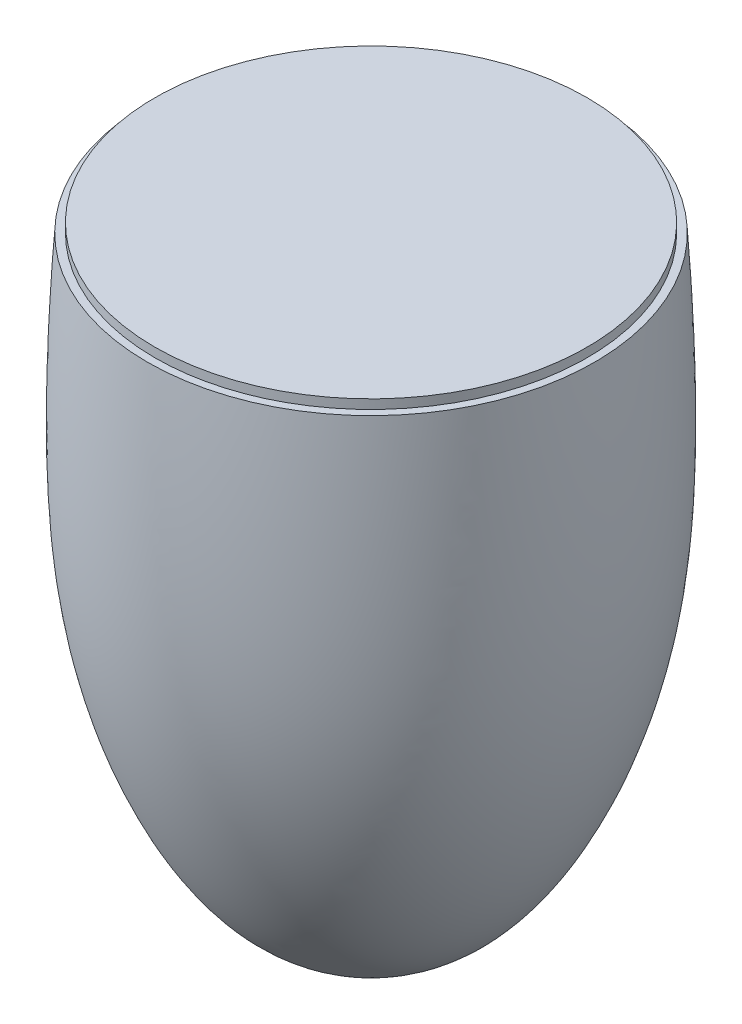
ISO-10303-21;
HEADER;
FILE_DESCRIPTION(('STEP AP214'),'2;1');
FILE_NAME('part.step','',(''),(''),'','','');
FILE_SCHEMA(('AUTOMOTIVE_DESIGN { 1 0 10303 214 1 1 1 1 }'));
ENDSEC;
DATA;
#1=APPLICATION_CONTEXT('core data for automotive mechanical design processes');
#2=APPLICATION_PROTOCOL_DEFINITION('international standard','automotive_design',2000,#1);
#3=PRODUCT_CONTEXT('',#1,'mechanical');
#4=PRODUCT('Part','Part','',(#3));
#5=PRODUCT_RELATED_PRODUCT_CATEGORY('part','',(#4));
#6=PRODUCT_DEFINITION_FORMATION('','',#4);
#7=PRODUCT_DEFINITION_CONTEXT('part definition',#1,'design');
#8=PRODUCT_DEFINITION('design','',#6,#7);
#9=PRODUCT_DEFINITION_SHAPE('','',#8);
#10=(LENGTH_UNIT() NAMED_UNIT(*) SI_UNIT(.MILLI.,.METRE.));
#11=(NAMED_UNIT(*) PLANE_ANGLE_UNIT() SI_UNIT($,.RADIAN.));
#12=(NAMED_UNIT(*) SI_UNIT($,.STERADIAN.) SOLID_ANGLE_UNIT());
#13=UNCERTAINTY_MEASURE_WITH_UNIT(LENGTH_MEASURE(1.E-05),#10,'distance_accuracy_value','');
#14=(GEOMETRIC_REPRESENTATION_CONTEXT(3) GLOBAL_UNCERTAINTY_ASSIGNED_CONTEXT((#13)) GLOBAL_UNIT_ASSIGNED_CONTEXT((#10,
#11,#12)) REPRESENTATION_CONTEXT('',''));
#15=CARTESIAN_POINT('',(0.,0.,0.));
#16=DIRECTION('',(0.,0.,1.));
#17=DIRECTION('',(1.,0.,0.));
#18=AXIS2_PLACEMENT_3D('',#15,#16,#17);
#19=CARTESIAN_POINT('',(0.,81.9449157715,24.1451148987));
#20=DIRECTION('',(0.,1.,0.));
#21=DIRECTION('',(0.,0.,1.));
#22=AXIS2_PLACEMENT_3D('',#19,#20,#21);
#23=PLANE('',#22);
#24=CARTESIAN_POINT('',(0.,81.9449157715,0.));
#25=DIRECTION('',(0.,1.,0.));
#26=DIRECTION('',(0.,0.,1.));
#27=AXIS2_PLACEMENT_3D('',#24,#25,#26);
#28=CIRCLE('',#27,24.1451148987);
#29=CARTESIAN_POINT('',(0.,81.9449157715,24.1451148987));
#30=VERTEX_POINT('',#29);
#31=EDGE_CURVE('E19',#30,#30,#28,.F.);
#32=ORIENTED_EDGE('',*,*,#31,.F.);
#33=EDGE_LOOP('',(#32));
#34=FACE_BOUND('',#33,.T.);
#35=ADVANCED_FACE('F16',(#34),#23,.T.);
#36=CARTESIAN_POINT('',(0.,47.5297081951,0.));
#37=DIRECTION('',(0.,1.,0.));
#38=DIRECTION('',(0.,0.,1.));
#39=AXIS2_PLACEMENT_3D('',#36,#37,#38);
#40=CYLINDRICAL_SURFACE('',#39,24.1451148987);
#41=CARTESIAN_POINT('',(0.,80.9171676635999,0.));
#42=DIRECTION('',(0.,1.,0.));
#43=DIRECTION('',(0.479425538604204,0.,0.877582561890372));
#44=AXIS2_PLACEMENT_3D('',#41,#42,#43);
#45=CIRCLE('',#44,24.1451148986807);
#46=CARTESIAN_POINT('',(11.5757847149604,80.9171676635999,21.1893317899216));
#47=VERTEX_POINT('',#46);
#48=EDGE_CURVE('E23',#47,#47,#45,.T.);
#49=ORIENTED_EDGE('',*,*,#48,.T.);
#50=EDGE_LOOP('',(#49));
#51=FACE_BOUND('',#50,.T.);
#52=ORIENTED_EDGE('',*,*,#31,.T.);
#53=EDGE_LOOP('',(#52));
#54=FACE_BOUND('',#53,.T.);
#55=ADVANCED_FACE('F36',(#51,#54),#40,.T.);
#56=CARTESIAN_POINT('',(0.,80.9195556640865,0.));
#57=DIRECTION('',(0.,1.,0.));
#58=DIRECTION('',(0.,0.,1.));
#59=AXIS2_PLACEMENT_3D('',#56,#57,#58);
#60=CONICAL_SURFACE('',#59,24.9904174804408,1.56797130983);
#61=CARTESIAN_POINT('',(0.,80.9195556641,0.));
#62=DIRECTION('',(0.,-1.,0.));
#63=DIRECTION('',(0.,0.,1.));
#64=AXIS2_PLACEMENT_3D('',#61,#62,#63);
#65=CIRCLE('',#64,24.9904174805);
#66=CARTESIAN_POINT('',(0.,80.9195556641,24.9904174805));
#67=VERTEX_POINT('',#66);
#68=EDGE_CURVE('E11',#67,#67,#65,.T.);
#69=ORIENTED_EDGE('',*,*,#68,.F.);
#70=EDGE_LOOP('',(#69));
#71=FACE_BOUND('',#70,.T.);
#72=ORIENTED_EDGE('',*,*,#48,.F.);
#73=EDGE_LOOP('',(#72));
#74=FACE_BOUND('',#73,.T.);
#75=ADVANCED_FACE('F30',(#71,#74),#60,.F.);
#76=CARTESIAN_POINT('',(0.,13.2139997482,0.));
#77=CARTESIAN_POINT('',(0.,13.1343860519,0.701525521778));
#78=CARTESIAN_POINT('',(0.,13.0946252586,1.39098266925));
#79=CARTESIAN_POINT('',(0.,13.0947173683,2.0683714424));
#80=CARTESIAN_POINT('',(0.,13.4000439852,7.15386304117));
#81=CARTESIAN_POINT('',(0.,16.0068979726,11.5324651143));
#82=CARTESIAN_POINT('',(0.,19.8763681206,14.795236085));
#83=CARTESIAN_POINT('',(0.,29.4703767584,20.5230421088));
#84=CARTESIAN_POINT('',(0.,39.6672446479,23.6110537972));
#85=CARTESIAN_POINT('',(0.,44.6271882231,24.5798553527));
#86=CARTESIAN_POINT('',(0.,54.3610779814,25.7066458761));
#87=CARTESIAN_POINT('',(0.,64.3115919466,25.7342793237));
#88=CARTESIAN_POINT('',(0.,69.5902544986,25.6172746961));
#89=CARTESIAN_POINT('',(0.,75.1262424044,25.3693207484));
#90=CARTESIAN_POINT('',(0.,80.9195556641,24.9904174805));
#91=(BOUNDED_CURVE() B_SPLINE_CURVE(5,(#76,#77,#78,#79,#80,#81,#82,#83,#84,#85,#86,#87,#88,#89,
#90),.UNSPECIFIED.,.F.,.F.) B_SPLINE_CURVE_WITH_KNOTS((6,3,3,3,6),(0.,3.38691329956,
25.8884578925,51.9993142439,78.5983632273),
.UNSPECIFIED.) CURVE() GEOMETRIC_REPRESENTATION_ITEM() RATIONAL_B_SPLINE_CURVE((1.,1.,1.,1.,1.,
1.,1.,1.,1.,1.,1.,1.,1.,1.,1.)) REPRESENTATION_ITEM(''));
#92=CARTESIAN_POINT('',(0.,47.5297081951,0.));
#93=DIRECTION('',(0.,-1.,0.));
#94=AXIS1_PLACEMENT('',#92,#93);
#95=SURFACE_OF_REVOLUTION('',#91,#94);
#96=CARTESIAN_POINT('',(2.33611357876979E-07,13.2139996929011,4.27622722246624E-07));
#97=VERTEX_POINT('',#96);
#98=VERTEX_LOOP('',#97);
#99=FACE_BOUND('',#98,.T.);
#100=ORIENTED_EDGE('',*,*,#68,.T.);
#101=EDGE_LOOP('',(#100));
#102=FACE_BOUND('',#101,.T.);
#103=ADVANCED_FACE('F27',(#99,#102),#95,.F.);
#104=CLOSED_SHELL('',(#35,#55,#75,#103));
#105=MANIFOLD_SOLID_BREP('B1',#104);
#106=ADVANCED_BREP_SHAPE_REPRESENTATION('',(#18,#105),#14);
#107=SHAPE_DEFINITION_REPRESENTATION(#9,#106);
ENDSEC;
END-ISO-10303-21;
